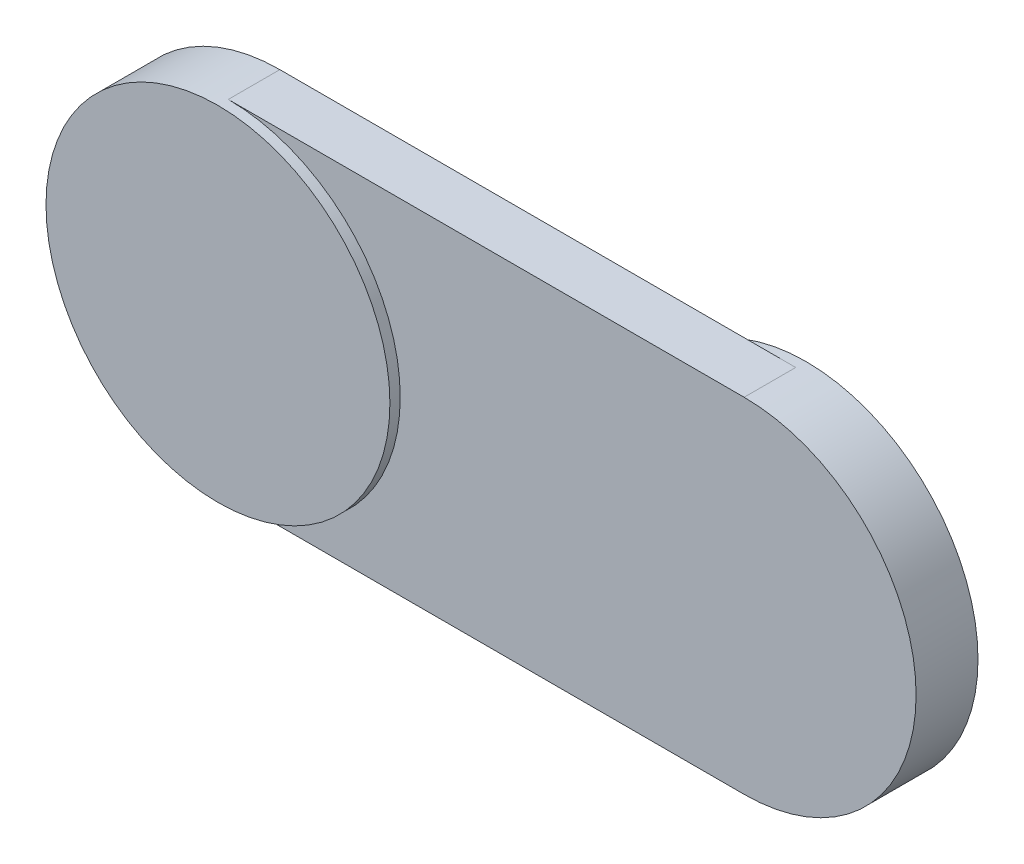
ISO-10303-21;
HEADER;
FILE_DESCRIPTION(('STEP AP214'),'2;1');
FILE_NAME('part.step','',(''),(''),'','','');
FILE_SCHEMA(('AUTOMOTIVE_DESIGN { 1 0 10303 214 1 1 1 1 }'));
ENDSEC;
DATA;
#1=APPLICATION_CONTEXT('core data for automotive mechanical design processes');
#2=APPLICATION_PROTOCOL_DEFINITION('international standard','automotive_design',2000,#1);
#3=PRODUCT_CONTEXT('',#1,'mechanical');
#4=PRODUCT('Part','Part','',(#3));
#5=PRODUCT_RELATED_PRODUCT_CATEGORY('part','',(#4));
#6=PRODUCT_DEFINITION_FORMATION('','',#4);
#7=PRODUCT_DEFINITION_CONTEXT('part definition',#1,'design');
#8=PRODUCT_DEFINITION('design','',#6,#7);
#9=PRODUCT_DEFINITION_SHAPE('','',#8);
#10=(LENGTH_UNIT() NAMED_UNIT(*) SI_UNIT(.MILLI.,.METRE.));
#11=(NAMED_UNIT(*) PLANE_ANGLE_UNIT() SI_UNIT($,.RADIAN.));
#12=(NAMED_UNIT(*) SI_UNIT($,.STERADIAN.) SOLID_ANGLE_UNIT());
#13=UNCERTAINTY_MEASURE_WITH_UNIT(LENGTH_MEASURE(1.E-05),#10,'distance_accuracy_value','');
#14=(GEOMETRIC_REPRESENTATION_CONTEXT(3) GLOBAL_UNCERTAINTY_ASSIGNED_CONTEXT((#13)) GLOBAL_UNIT_ASSIGNED_CONTEXT((#10,
#11,#12)) REPRESENTATION_CONTEXT('',''));
#15=CARTESIAN_POINT('',(0.,0.,0.));
#16=DIRECTION('',(0.,0.,1.));
#17=DIRECTION('',(1.,0.,0.));
#18=AXIS2_PLACEMENT_3D('',#15,#16,#17);
#19=CARTESIAN_POINT('',(0.,100.,15.));
#20=DIRECTION('',(0.,-1.,0.));
#21=DIRECTION('',(1.,0.,0.));
#22=AXIS2_PLACEMENT_3D('',#19,#20,#21);
#23=PLANE('',#22);
#24=DIRECTION('',(-1.,0.,0.));
#25=VECTOR('',#24,1.);
#26=CARTESIAN_POINT('',(0.,100.,0.));
#27=LINE('',#26,#25);
#28=CARTESIAN_POINT('',(0.,100.,0.));
#29=VERTEX_POINT('',#28);
#30=CARTESIAN_POINT('',(-150.,100.,0.));
#31=VERTEX_POINT('',#30);
#32=EDGE_CURVE('E82',#29,#31,#27,.T.);
#33=ORIENTED_EDGE('',*,*,#32,.T.);
#34=DIRECTION('',(0.,0.,-1.));
#35=VECTOR('',#34,1.);
#36=CARTESIAN_POINT('',(-150.,100.,15.));
#37=LINE('',#36,#35);
#38=CARTESIAN_POINT('',(-150.,100.,15.));
#39=VERTEX_POINT('',#38);
#40=EDGE_CURVE('E48',#39,#31,#37,.T.);
#41=ORIENTED_EDGE('',*,*,#40,.F.);
#42=DIRECTION('',(-1.,0.,0.));
#43=VECTOR('',#42,1.);
#44=CARTESIAN_POINT('',(0.,100.,15.));
#45=LINE('',#44,#43);
#46=CARTESIAN_POINT('',(0.,100.,15.));
#47=VERTEX_POINT('',#46);
#48=EDGE_CURVE('E94',#47,#39,#45,.T.);
#49=ORIENTED_EDGE('',*,*,#48,.F.);
#50=DIRECTION('',(0.,0.,-1.));
#51=VECTOR('',#50,1.);
#52=CARTESIAN_POINT('',(0.,100.,15.));
#53=LINE('',#52,#51);
#54=EDGE_CURVE('E11',#47,#29,#53,.T.);
#55=ORIENTED_EDGE('',*,*,#54,.T.);
#56=EDGE_LOOP('',(#33,#41,#49,#55));
#57=FACE_BOUND('',#56,.T.);
#58=ADVANCED_FACE('F39',(#57),#23,.F.);
#59=CARTESIAN_POINT('',(0.,0.,15.));
#60=DIRECTION('',(0.,-1.,0.));
#61=DIRECTION('',(1.,0.,0.));
#62=AXIS2_PLACEMENT_3D('',#59,#60,#61);
#63=PLANE('',#62);
#64=DIRECTION('',(-1.,0.,0.));
#65=VECTOR('',#64,1.);
#66=CARTESIAN_POINT('',(0.,0.,0.));
#67=LINE('',#66,#65);
#68=CARTESIAN_POINT('',(0.,0.,0.));
#69=VERTEX_POINT('',#68);
#70=CARTESIAN_POINT('',(-150.,0.,0.));
#71=VERTEX_POINT('',#70);
#72=EDGE_CURVE('E80',#69,#71,#67,.T.);
#73=ORIENTED_EDGE('',*,*,#72,.F.);
#74=DIRECTION('',(0.,0.,-1.));
#75=VECTOR('',#74,1.);
#76=CARTESIAN_POINT('',(0.,0.,15.));
#77=LINE('',#76,#75);
#78=CARTESIAN_POINT('',(0.,0.,15.));
#79=VERTEX_POINT('',#78);
#80=EDGE_CURVE('E55',#79,#69,#77,.T.);
#81=ORIENTED_EDGE('',*,*,#80,.F.);
#82=DIRECTION('',(-1.,0.,0.));
#83=VECTOR('',#82,1.);
#84=CARTESIAN_POINT('',(0.,0.,15.));
#85=LINE('',#84,#83);
#86=CARTESIAN_POINT('',(-150.,0.,15.));
#87=VERTEX_POINT('',#86);
#88=EDGE_CURVE('E102',#79,#87,#85,.T.);
#89=ORIENTED_EDGE('',*,*,#88,.T.);
#90=DIRECTION('',(0.,0.,-1.));
#91=VECTOR('',#90,1.);
#92=CARTESIAN_POINT('',(-150.,0.,15.));
#93=LINE('',#92,#91);
#94=EDGE_CURVE('E92',#87,#71,#93,.T.);
#95=ORIENTED_EDGE('',*,*,#94,.T.);
#96=EDGE_LOOP('',(#73,#81,#89,#95));
#97=FACE_BOUND('',#96,.T.);
#98=ADVANCED_FACE('F90',(#97),#63,.T.);
#99=CARTESIAN_POINT('',(0.,0.,15.));
#100=DIRECTION('',(0.,0.,1.));
#101=DIRECTION('',(1.,0.,0.));
#102=AXIS2_PLACEMENT_3D('',#99,#100,#101);
#103=PLANE('',#102);
#104=ORIENTED_EDGE('',*,*,#48,.T.);
#105=CARTESIAN_POINT('',(-150.,50.,15.));
#106=DIRECTION('',(0.,0.,1.));
#107=DIRECTION('',(1.,0.,0.));
#108=AXIS2_PLACEMENT_3D('',#105,#106,#107);
#109=CIRCLE('',#108,50.);
#110=EDGE_CURVE('E116',#39,#87,#109,.F.);
#111=ORIENTED_EDGE('',*,*,#110,.T.);
#112=ORIENTED_EDGE('',*,*,#88,.F.);
#113=CARTESIAN_POINT('',(0.,50.,15.));
#114=DIRECTION('',(0.,0.,1.));
#115=DIRECTION('',(1.,0.,0.));
#116=AXIS2_PLACEMENT_3D('',#113,#114,#115);
#117=CIRCLE('',#116,50.);
#118=EDGE_CURVE('E100',#79,#47,#117,.T.);
#119=ORIENTED_EDGE('',*,*,#118,.T.);
#120=EDGE_LOOP('',(#104,#111,#112,#119));
#121=FACE_BOUND('',#120,.T.);
#122=ADVANCED_FACE('F159',(#121),#103,.T.);
#123=CARTESIAN_POINT('',(0.,0.,0.));
#124=DIRECTION('',(0.,0.,1.));
#125=DIRECTION('',(1.,0.,0.));
#126=AXIS2_PLACEMENT_3D('',#123,#124,#125);
#127=PLANE('',#126);
#128=CARTESIAN_POINT('',(-75.,50.,0.));
#129=DIRECTION('',(0.,0.,1.));
#130=DIRECTION('',(1.,0.,0.));
#131=AXIS2_PLACEMENT_3D('',#128,#129,#130);
#132=CIRCLE('',#131,5.00000000000001);
#133=CARTESIAN_POINT('',(-70.,50.,0.));
#134=VERTEX_POINT('',#133);
#135=EDGE_CURVE('E136',#134,#134,#132,.T.);
#136=ORIENTED_EDGE('',*,*,#135,.T.);
#137=EDGE_LOOP('',(#136));
#138=FACE_BOUND('',#137,.T.);
#139=ORIENTED_EDGE('',*,*,#32,.F.);
#140=CARTESIAN_POINT('',(0.,50.,0.));
#141=DIRECTION('',(0.,0.,1.));
#142=DIRECTION('',(1.,0.,0.));
#143=AXIS2_PLACEMENT_3D('',#140,#141,#142);
#144=CIRCLE('',#143,50.);
#145=EDGE_CURVE('E77',#29,#69,#144,.T.);
#146=ORIENTED_EDGE('',*,*,#145,.T.);
#147=ORIENTED_EDGE('',*,*,#72,.T.);
#148=CARTESIAN_POINT('',(-150.,50.,0.));
#149=DIRECTION('',(0.,0.,1.));
#150=DIRECTION('',(1.,0.,0.));
#151=AXIS2_PLACEMENT_3D('',#148,#149,#150);
#152=CIRCLE('',#151,50.);
#153=EDGE_CURVE('E115',#31,#71,#152,.T.);
#154=ORIENTED_EDGE('',*,*,#153,.F.);
#155=EDGE_LOOP('',(#139,#146,#147,#154));
#156=FACE_BOUND('',#155,.T.);
#157=ADVANCED_FACE('F78',(#138,#156),#127,.F.);
#158=CARTESIAN_POINT('',(0.,50.,15.));
#159=DIRECTION('',(0.,0.,-1.));
#160=DIRECTION('',(-1.,0.,0.));
#161=AXIS2_PLACEMENT_3D('',#158,#159,#160);
#162=CYLINDRICAL_SURFACE('',#161,50.);
#163=ORIENTED_EDGE('',*,*,#80,.T.);
#164=ORIENTED_EDGE('',*,*,#145,.F.);
#165=ORIENTED_EDGE('',*,*,#54,.F.);
#166=ORIENTED_EDGE('',*,*,#118,.F.);
#167=EDGE_LOOP('',(#163,#164,#165,#166));
#168=FACE_BOUND('',#167,.T.);
#169=CARTESIAN_POINT('',(0.,50.,-3.));
#170=DIRECTION('',(0.,0.,1.));
#171=DIRECTION('',(1.,0.,0.));
#172=AXIS2_PLACEMENT_3D('',#169,#170,#171);
#173=CIRCLE('',#172,50.);
#174=CARTESIAN_POINT('',(50.,50.,-3.));
#175=VERTEX_POINT('',#174);
#176=EDGE_CURVE('E86',#175,#175,#173,.T.);
#177=ORIENTED_EDGE('',*,*,#176,.T.);
#178=EDGE_LOOP('',(#177));
#179=FACE_BOUND('',#178,.T.);
#180=ADVANCED_FACE('F97',(#168,#179),#162,.T.);
#181=CARTESIAN_POINT('',(-150.,50.,15.));
#182=DIRECTION('',(0.,0.,-1.));
#183=DIRECTION('',(-1.,0.,0.));
#184=AXIS2_PLACEMENT_3D('',#181,#182,#183);
#185=CYLINDRICAL_SURFACE('',#184,50.);
#186=ORIENTED_EDGE('',*,*,#153,.T.);
#187=ORIENTED_EDGE('',*,*,#94,.F.);
#188=ORIENTED_EDGE('',*,*,#110,.F.);
#189=ORIENTED_EDGE('',*,*,#40,.T.);
#190=EDGE_LOOP('',(#186,#187,#188,#189));
#191=FACE_BOUND('',#190,.T.);
#192=CARTESIAN_POINT('',(-150.,50.,18.));
#193=DIRECTION('',(0.,0.,1.));
#194=DIRECTION('',(1.,0.,0.));
#195=AXIS2_PLACEMENT_3D('',#192,#193,#194);
#196=CIRCLE('',#195,50.);
#197=CARTESIAN_POINT('',(-100.,50.,18.));
#198=VERTEX_POINT('',#197);
#199=EDGE_CURVE('E129',#198,#198,#196,.T.);
#200=ORIENTED_EDGE('',*,*,#199,.F.);
#201=EDGE_LOOP('',(#200));
#202=FACE_BOUND('',#201,.T.);
#203=ADVANCED_FACE('F113',(#191,#202),#185,.T.);
#204=CARTESIAN_POINT('',(0.,0.,18.));
#205=DIRECTION('',(0.,0.,1.));
#206=DIRECTION('',(1.,0.,0.));
#207=AXIS2_PLACEMENT_3D('',#204,#205,#206);
#208=PLANE('',#207);
#209=ORIENTED_EDGE('',*,*,#199,.T.);
#210=EDGE_LOOP('',(#209));
#211=FACE_BOUND('',#210,.T.);
#212=ADVANCED_FACE('F173',(#211),#208,.T.);
#213=CARTESIAN_POINT('',(0.,0.,-3.));
#214=DIRECTION('',(0.,0.,1.));
#215=DIRECTION('',(1.,0.,0.));
#216=AXIS2_PLACEMENT_3D('',#213,#214,#215);
#217=PLANE('',#216);
#218=ORIENTED_EDGE('',*,*,#176,.F.);
#219=EDGE_LOOP('',(#218));
#220=FACE_BOUND('',#219,.T.);
#221=ADVANCED_FACE('F153',(#220),#217,.F.);
#222=CARTESIAN_POINT('',(-75.,50.,-25.));
#223=DIRECTION('',(0.,0.,1.));
#224=DIRECTION('',(1.,0.,0.));
#225=AXIS2_PLACEMENT_3D('',#222,#223,#224);
#226=CYLINDRICAL_SURFACE('',#225,5.00000000000001);
#227=CARTESIAN_POINT('',(-75.,50.,-25.));
#228=DIRECTION('',(0.,0.,1.));
#229=DIRECTION('',(1.,0.,0.));
#230=AXIS2_PLACEMENT_3D('',#227,#228,#229);
#231=CIRCLE('',#230,5.00000000000001);
#232=CARTESIAN_POINT('',(-70.,50.,-25.));
#233=VERTEX_POINT('',#232);
#234=EDGE_CURVE('E87',#233,#233,#231,.T.);
#235=ORIENTED_EDGE('',*,*,#234,.T.);
#236=EDGE_LOOP('',(#235));
#237=FACE_BOUND('',#236,.T.);
#238=ORIENTED_EDGE('',*,*,#135,.F.);
#239=EDGE_LOOP('',(#238));
#240=FACE_BOUND('',#239,.T.);
#241=ADVANCED_FACE('F144',(#237,#240),#226,.T.);
#242=CARTESIAN_POINT('',(-75.,50.,-25.));
#243=DIRECTION('',(0.,0.,1.));
#244=DIRECTION('',(1.,0.,0.));
#245=AXIS2_PLACEMENT_3D('',#242,#243,#244);
#246=PLANE('',#245);
#247=ORIENTED_EDGE('',*,*,#234,.F.);
#248=EDGE_LOOP('',(#247));
#249=FACE_BOUND('',#248,.T.);
#250=ADVANCED_FACE('F147',(#249),#246,.F.);
#251=CLOSED_SHELL('',(#58,#98,#122,#157,#180,#203,#212,#221,#241,#250));
#252=MANIFOLD_SOLID_BREP('B2',#251);
#253=ADVANCED_BREP_SHAPE_REPRESENTATION('',(#18,#252),#14);
#254=SHAPE_DEFINITION_REPRESENTATION(#9,#253);
ENDSEC;
END-ISO-10303-21;
